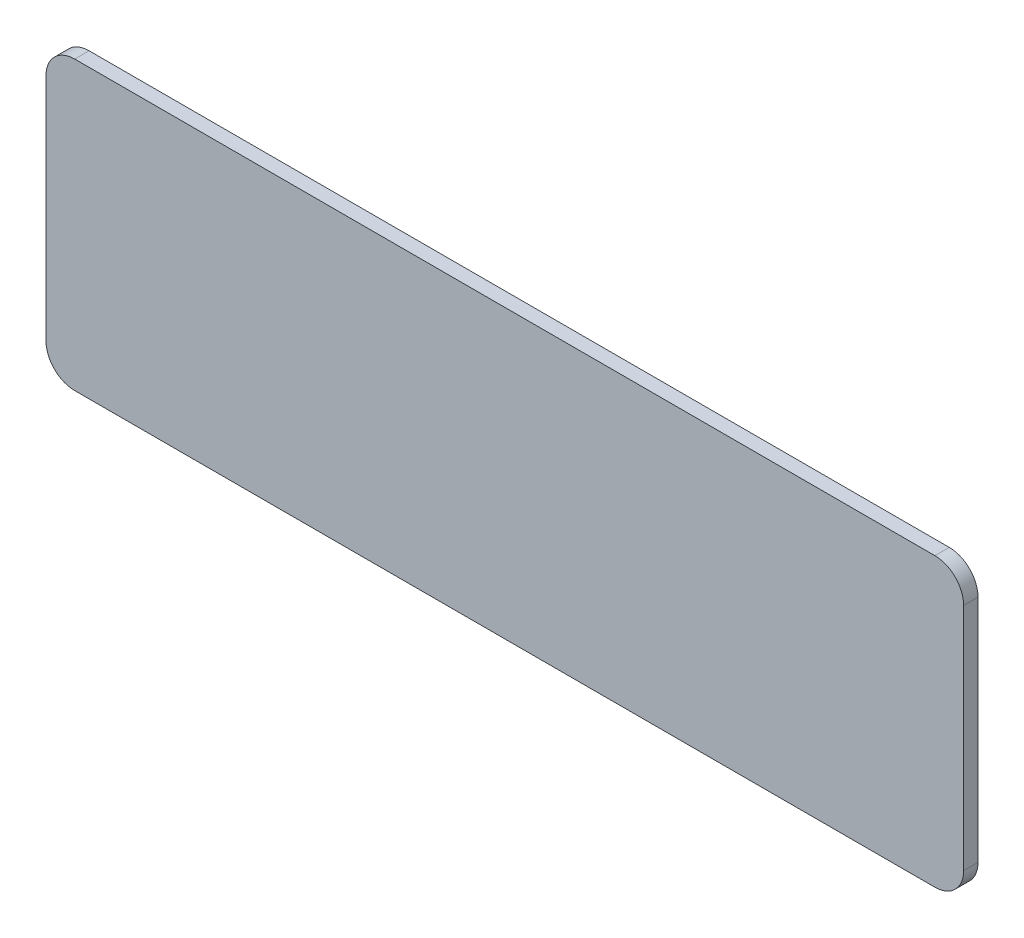
ISO-10303-21;
HEADER;
FILE_DESCRIPTION(('STEP AP214'),'2;1');
FILE_NAME('part.step','',(''),(''),'','','');
FILE_SCHEMA(('AUTOMOTIVE_DESIGN { 1 0 10303 214 1 1 1 1 }'));
ENDSEC;
DATA;
#1=APPLICATION_CONTEXT('core data for automotive mechanical design processes');
#2=APPLICATION_PROTOCOL_DEFINITION('international standard','automotive_design',2000,#1);
#3=PRODUCT_CONTEXT('',#1,'mechanical');
#4=PRODUCT('Part','Part','',(#3));
#5=PRODUCT_RELATED_PRODUCT_CATEGORY('part','',(#4));
#6=PRODUCT_DEFINITION_FORMATION('','',#4);
#7=PRODUCT_DEFINITION_CONTEXT('part definition',#1,'design');
#8=PRODUCT_DEFINITION('design','',#6,#7);
#9=PRODUCT_DEFINITION_SHAPE('','',#8);
#10=(LENGTH_UNIT() NAMED_UNIT(*) SI_UNIT(.MILLI.,.METRE.));
#11=(NAMED_UNIT(*) PLANE_ANGLE_UNIT() SI_UNIT($,.RADIAN.));
#12=(NAMED_UNIT(*) SI_UNIT($,.STERADIAN.) SOLID_ANGLE_UNIT());
#13=UNCERTAINTY_MEASURE_WITH_UNIT(LENGTH_MEASURE(1.E-05),#10,'distance_accuracy_value','');
#14=(GEOMETRIC_REPRESENTATION_CONTEXT(3) GLOBAL_UNCERTAINTY_ASSIGNED_CONTEXT((#13)) GLOBAL_UNIT_ASSIGNED_CONTEXT((#10,
#11,#12)) REPRESENTATION_CONTEXT('',''));
#15=CARTESIAN_POINT('',(0.,0.,0.));
#16=DIRECTION('',(0.,0.,1.));
#17=DIRECTION('',(1.,0.,0.));
#18=AXIS2_PLACEMENT_3D('',#15,#16,#17);
#19=CARTESIAN_POINT('',(419.14,80.0000000000001,10.));
#20=DIRECTION('',(0.,0.,-1.));
#21=DIRECTION('',(-1.,0.,0.));
#22=AXIS2_PLACEMENT_3D('',#19,#20,#21);
#23=CYLINDRICAL_SURFACE('',#22,20.);
#24=CARTESIAN_POINT('',(419.14,80.0000000000001,0.));
#25=DIRECTION('',(0.,0.,1.));
#26=DIRECTION('',(-1.,0.,0.));
#27=AXIS2_PLACEMENT_3D('',#24,#25,#26);
#28=CIRCLE('',#27,20.);
#29=CARTESIAN_POINT('',(439.14,80.0000000000001,0.));
#30=VERTEX_POINT('',#29);
#31=CARTESIAN_POINT('',(419.14,100.,0.));
#32=VERTEX_POINT('',#31);
#33=EDGE_CURVE('E129',#30,#32,#28,.T.);
#34=ORIENTED_EDGE('',*,*,#33,.T.);
#35=DIRECTION('',(0.,0.,-1.));
#36=VECTOR('',#35,1.);
#37=CARTESIAN_POINT('',(419.14,100.,10.));
#38=LINE('',#37,#36);
#39=CARTESIAN_POINT('',(419.14,100.,10.));
#40=VERTEX_POINT('',#39);
#41=EDGE_CURVE('E11',#40,#32,#38,.T.);
#42=ORIENTED_EDGE('',*,*,#41,.F.);
#43=CARTESIAN_POINT('',(419.14,80.0000000000001,10.));
#44=DIRECTION('',(0.,0.,1.));
#45=DIRECTION('',(-1.,0.,0.));
#46=AXIS2_PLACEMENT_3D('',#43,#44,#45);
#47=CIRCLE('',#46,20.);
#48=CARTESIAN_POINT('',(439.14,80.0000000000001,10.));
#49=VERTEX_POINT('',#48);
#50=EDGE_CURVE('E143',#49,#40,#47,.T.);
#51=ORIENTED_EDGE('',*,*,#50,.F.);
#52=DIRECTION('',(0.,0.,-1.));
#53=VECTOR('',#52,1.);
#54=CARTESIAN_POINT('',(439.14,80.0000000000001,10.));
#55=LINE('',#54,#53);
#56=EDGE_CURVE('E125',#49,#30,#55,.T.);
#57=ORIENTED_EDGE('',*,*,#56,.T.);
#58=EDGE_LOOP('',(#34,#42,#51,#57));
#59=FACE_BOUND('',#58,.T.);
#60=ADVANCED_FACE('F33',(#59),#23,.T.);
#61=CARTESIAN_POINT('',(419.14,100.,10.));
#62=DIRECTION('',(0.,-1.,0.));
#63=DIRECTION('',(1.,0.,0.));
#64=AXIS2_PLACEMENT_3D('',#61,#62,#63);
#65=PLANE('',#64);
#66=DIRECTION('',(-1.,0.,0.));
#67=VECTOR('',#66,1.);
#68=CARTESIAN_POINT('',(419.14,100.,0.));
#69=LINE('',#68,#67);
#70=CARTESIAN_POINT('',(-180.,100.,0.));
#71=VERTEX_POINT('',#70);
#72=EDGE_CURVE('E132',#32,#71,#69,.T.);
#73=ORIENTED_EDGE('',*,*,#72,.T.);
#74=DIRECTION('',(0.,0.,-1.));
#75=VECTOR('',#74,1.);
#76=CARTESIAN_POINT('',(-180.,100.,10.));
#77=LINE('',#76,#75);
#78=CARTESIAN_POINT('',(-180.,100.,10.));
#79=VERTEX_POINT('',#78);
#80=EDGE_CURVE('E41',#79,#71,#77,.T.);
#81=ORIENTED_EDGE('',*,*,#80,.F.);
#82=DIRECTION('',(-1.,0.,0.));
#83=VECTOR('',#82,1.);
#84=CARTESIAN_POINT('',(419.14,100.,10.));
#85=LINE('',#84,#83);
#86=EDGE_CURVE('E92',#40,#79,#85,.T.);
#87=ORIENTED_EDGE('',*,*,#86,.F.);
#88=ORIENTED_EDGE('',*,*,#41,.T.);
#89=EDGE_LOOP('',(#73,#81,#87,#88));
#90=FACE_BOUND('',#89,.T.);
#91=ADVANCED_FACE('F178',(#90),#65,.F.);
#92=CARTESIAN_POINT('',(-180.,80.,10.));
#93=DIRECTION('',(0.,0.,-1.));
#94=DIRECTION('',(-1.,0.,0.));
#95=AXIS2_PLACEMENT_3D('',#92,#93,#94);
#96=CYLINDRICAL_SURFACE('',#95,20.);
#97=CARTESIAN_POINT('',(-180.,80.,0.));
#98=DIRECTION('',(0.,0.,1.));
#99=DIRECTION('',(1.,0.,0.));
#100=AXIS2_PLACEMENT_3D('',#97,#98,#99);
#101=CIRCLE('',#100,20.);
#102=CARTESIAN_POINT('',(-200.,79.9999999999999,0.));
#103=VERTEX_POINT('',#102);
#104=EDGE_CURVE('E134',#71,#103,#101,.T.);
#105=ORIENTED_EDGE('',*,*,#104,.T.);
#106=DIRECTION('',(0.,0.,-1.));
#107=VECTOR('',#106,1.);
#108=CARTESIAN_POINT('',(-200.,79.9999999999999,10.));
#109=LINE('',#108,#107);
#110=CARTESIAN_POINT('',(-200.,79.9999999999999,10.));
#111=VERTEX_POINT('',#110);
#112=EDGE_CURVE('E150',#111,#103,#109,.T.);
#113=ORIENTED_EDGE('',*,*,#112,.F.);
#114=CARTESIAN_POINT('',(-180.,80.,10.));
#115=DIRECTION('',(0.,0.,1.));
#116=DIRECTION('',(1.,0.,0.));
#117=AXIS2_PLACEMENT_3D('',#114,#115,#116);
#118=CIRCLE('',#117,20.);
#119=EDGE_CURVE('E158',#79,#111,#118,.T.);
#120=ORIENTED_EDGE('',*,*,#119,.F.);
#121=ORIENTED_EDGE('',*,*,#80,.T.);
#122=EDGE_LOOP('',(#105,#113,#120,#121));
#123=FACE_BOUND('',#122,.T.);
#124=ADVANCED_FACE('F156',(#123),#96,.T.);
#125=CARTESIAN_POINT('',(-200.,79.9999999999999,10.));
#126=DIRECTION('',(1.,0.,0.));
#127=DIRECTION('',(0.,1.,0.));
#128=AXIS2_PLACEMENT_3D('',#125,#126,#127);
#129=PLANE('',#128);
#130=DIRECTION('',(0.,-1.,0.));
#131=VECTOR('',#130,1.);
#132=CARTESIAN_POINT('',(-200.,79.9999999999999,0.));
#133=LINE('',#132,#131);
#134=CARTESIAN_POINT('',(-200.,-79.9999999999999,0.));
#135=VERTEX_POINT('',#134);
#136=EDGE_CURVE('E136',#103,#135,#133,.T.);
#137=ORIENTED_EDGE('',*,*,#136,.T.);
#138=DIRECTION('',(0.,0.,-1.));
#139=VECTOR('',#138,1.);
#140=CARTESIAN_POINT('',(-200.,-79.9999999999999,10.));
#141=LINE('',#140,#139);
#142=CARTESIAN_POINT('',(-200.,-79.9999999999999,10.));
#143=VERTEX_POINT('',#142);
#144=EDGE_CURVE('E147',#143,#135,#141,.T.);
#145=ORIENTED_EDGE('',*,*,#144,.F.);
#146=DIRECTION('',(0.,-1.,0.));
#147=VECTOR('',#146,1.);
#148=CARTESIAN_POINT('',(-200.,79.9999999999999,10.));
#149=LINE('',#148,#147);
#150=EDGE_CURVE('E170',#111,#143,#149,.T.);
#151=ORIENTED_EDGE('',*,*,#150,.F.);
#152=ORIENTED_EDGE('',*,*,#112,.T.);
#153=EDGE_LOOP('',(#137,#145,#151,#152));
#154=FACE_BOUND('',#153,.T.);
#155=ADVANCED_FACE('F166',(#154),#129,.F.);
#156=CARTESIAN_POINT('',(-180.,-80.,10.));
#157=DIRECTION('',(0.,0.,-1.));
#158=DIRECTION('',(-1.,0.,0.));
#159=AXIS2_PLACEMENT_3D('',#156,#157,#158);
#160=CYLINDRICAL_SURFACE('',#159,20.);
#161=CARTESIAN_POINT('',(-180.,-80.,0.));
#162=DIRECTION('',(0.,0.,1.));
#163=DIRECTION('',(-1.,0.,0.));
#164=AXIS2_PLACEMENT_3D('',#161,#162,#163);
#165=CIRCLE('',#164,20.);
#166=CARTESIAN_POINT('',(-180.,-100.,0.));
#167=VERTEX_POINT('',#166);
#168=EDGE_CURVE('E138',#135,#167,#165,.T.);
#169=ORIENTED_EDGE('',*,*,#168,.T.);
#170=DIRECTION('',(0.,0.,-1.));
#171=VECTOR('',#170,1.);
#172=CARTESIAN_POINT('',(-180.,-100.,10.));
#173=LINE('',#172,#171);
#174=CARTESIAN_POINT('',(-180.,-100.,10.));
#175=VERTEX_POINT('',#174);
#176=EDGE_CURVE('E120',#175,#167,#173,.T.);
#177=ORIENTED_EDGE('',*,*,#176,.F.);
#178=CARTESIAN_POINT('',(-180.,-80.,10.));
#179=DIRECTION('',(0.,0.,1.));
#180=DIRECTION('',(-1.,0.,0.));
#181=AXIS2_PLACEMENT_3D('',#178,#179,#180);
#182=CIRCLE('',#181,20.);
#183=EDGE_CURVE('E111',#143,#175,#182,.T.);
#184=ORIENTED_EDGE('',*,*,#183,.F.);
#185=ORIENTED_EDGE('',*,*,#144,.T.);
#186=EDGE_LOOP('',(#169,#177,#184,#185));
#187=FACE_BOUND('',#186,.T.);
#188=ADVANCED_FACE('F169',(#187),#160,.T.);
#189=CARTESIAN_POINT('',(419.14,-99.9999999999999,10.));
#190=DIRECTION('',(0.,1.,0.));
#191=DIRECTION('',(-1.,0.,0.));
#192=AXIS2_PLACEMENT_3D('',#189,#190,#191);
#193=PLANE('',#192);
#194=DIRECTION('',(1.,0.,0.));
#195=VECTOR('',#194,1.);
#196=CARTESIAN_POINT('',(419.14,-99.9999999999999,0.));
#197=LINE('',#196,#195);
#198=CARTESIAN_POINT('',(419.14,-99.9999999999999,0.));
#199=VERTEX_POINT('',#198);
#200=EDGE_CURVE('E119',#167,#199,#197,.T.);
#201=ORIENTED_EDGE('',*,*,#200,.T.);
#202=DIRECTION('',(0.,0.,-1.));
#203=VECTOR('',#202,1.);
#204=CARTESIAN_POINT('',(419.14,-99.9999999999999,10.));
#205=LINE('',#204,#203);
#206=CARTESIAN_POINT('',(419.14,-99.9999999999999,10.));
#207=VERTEX_POINT('',#206);
#208=EDGE_CURVE('E116',#207,#199,#205,.T.);
#209=ORIENTED_EDGE('',*,*,#208,.F.);
#210=DIRECTION('',(1.,0.,0.));
#211=VECTOR('',#210,1.);
#212=CARTESIAN_POINT('',(419.14,-99.9999999999999,10.));
#213=LINE('',#212,#211);
#214=EDGE_CURVE('E105',#175,#207,#213,.T.);
#215=ORIENTED_EDGE('',*,*,#214,.F.);
#216=ORIENTED_EDGE('',*,*,#176,.T.);
#217=EDGE_LOOP('',(#201,#209,#215,#216));
#218=FACE_BOUND('',#217,.T.);
#219=ADVANCED_FACE('F117',(#218),#193,.F.);
#220=CARTESIAN_POINT('',(419.14,-79.9999999999999,10.));
#221=DIRECTION('',(0.,0.,-1.));
#222=DIRECTION('',(-1.,0.,0.));
#223=AXIS2_PLACEMENT_3D('',#220,#221,#222);
#224=CYLINDRICAL_SURFACE('',#223,20.);
#225=CARTESIAN_POINT('',(419.14,-79.9999999999999,0.));
#226=DIRECTION('',(0.,0.,1.));
#227=DIRECTION('',(-1.,0.,0.));
#228=AXIS2_PLACEMENT_3D('',#225,#226,#227);
#229=CIRCLE('',#228,20.);
#230=CARTESIAN_POINT('',(439.14,-79.9999999999999,0.));
#231=VERTEX_POINT('',#230);
#232=EDGE_CURVE('E78',#199,#231,#229,.T.);
#233=ORIENTED_EDGE('',*,*,#232,.T.);
#234=DIRECTION('',(0.,0.,-1.));
#235=VECTOR('',#234,1.);
#236=CARTESIAN_POINT('',(439.14,-79.9999999999999,10.));
#237=LINE('',#236,#235);
#238=CARTESIAN_POINT('',(439.14,-79.9999999999999,10.));
#239=VERTEX_POINT('',#238);
#240=EDGE_CURVE('E121',#239,#231,#237,.T.);
#241=ORIENTED_EDGE('',*,*,#240,.F.);
#242=CARTESIAN_POINT('',(419.14,-79.9999999999999,10.));
#243=DIRECTION('',(0.,0.,1.));
#244=DIRECTION('',(-1.,0.,0.));
#245=AXIS2_PLACEMENT_3D('',#242,#243,#244);
#246=CIRCLE('',#245,20.);
#247=EDGE_CURVE('E109',#207,#239,#246,.T.);
#248=ORIENTED_EDGE('',*,*,#247,.F.);
#249=ORIENTED_EDGE('',*,*,#208,.T.);
#250=EDGE_LOOP('',(#233,#241,#248,#249));
#251=FACE_BOUND('',#250,.T.);
#252=ADVANCED_FACE('F123',(#251),#224,.T.);
#253=CARTESIAN_POINT('',(439.14,80.0000000000001,10.));
#254=DIRECTION('',(-1.,0.,0.));
#255=DIRECTION('',(0.,0.,1.));
#256=AXIS2_PLACEMENT_3D('',#253,#254,#255);
#257=PLANE('',#256);
#258=DIRECTION('',(0.,1.,0.));
#259=VECTOR('',#258,1.);
#260=CARTESIAN_POINT('',(439.14,80.0000000000001,0.));
#261=LINE('',#260,#259);
#262=EDGE_CURVE('E84',#231,#30,#261,.T.);
#263=ORIENTED_EDGE('',*,*,#262,.T.);
#264=ORIENTED_EDGE('',*,*,#56,.F.);
#265=DIRECTION('',(0.,1.,0.));
#266=VECTOR('',#265,1.);
#267=CARTESIAN_POINT('',(439.14,80.0000000000001,10.));
#268=LINE('',#267,#266);
#269=EDGE_CURVE('E49',#239,#49,#268,.T.);
#270=ORIENTED_EDGE('',*,*,#269,.F.);
#271=ORIENTED_EDGE('',*,*,#240,.T.);
#272=EDGE_LOOP('',(#263,#264,#270,#271));
#273=FACE_BOUND('',#272,.T.);
#274=ADVANCED_FACE('F194',(#273),#257,.F.);
#275=CARTESIAN_POINT('',(419.14,80.0000000000001,10.));
#276=DIRECTION('',(0.,0.,-1.));
#277=DIRECTION('',(-1.,0.,0.));
#278=AXIS2_PLACEMENT_3D('',#275,#276,#277);
#279=PLANE('',#278);
#280=ORIENTED_EDGE('',*,*,#50,.T.);
#281=ORIENTED_EDGE('',*,*,#86,.T.);
#282=ORIENTED_EDGE('',*,*,#119,.T.);
#283=ORIENTED_EDGE('',*,*,#150,.T.);
#284=ORIENTED_EDGE('',*,*,#183,.T.);
#285=ORIENTED_EDGE('',*,*,#214,.T.);
#286=ORIENTED_EDGE('',*,*,#247,.T.);
#287=ORIENTED_EDGE('',*,*,#269,.T.);
#288=EDGE_LOOP('',(#280,#281,#282,#283,#284,#285,#286,#287));
#289=FACE_BOUND('',#288,.T.);
#290=ADVANCED_FACE('F107',(#289),#279,.F.);
#291=CARTESIAN_POINT('',(419.14,80.0000000000001,0.));
#292=DIRECTION('',(0.,0.,-1.));
#293=DIRECTION('',(-1.,0.,0.));
#294=AXIS2_PLACEMENT_3D('',#291,#292,#293);
#295=PLANE('',#294);
#296=ORIENTED_EDGE('',*,*,#33,.F.);
#297=ORIENTED_EDGE('',*,*,#262,.F.);
#298=ORIENTED_EDGE('',*,*,#232,.F.);
#299=ORIENTED_EDGE('',*,*,#200,.F.);
#300=ORIENTED_EDGE('',*,*,#168,.F.);
#301=ORIENTED_EDGE('',*,*,#136,.F.);
#302=ORIENTED_EDGE('',*,*,#104,.F.);
#303=ORIENTED_EDGE('',*,*,#72,.F.);
#304=EDGE_LOOP('',(#296,#297,#298,#299,#300,#301,#302,#303));
#305=FACE_BOUND('',#304,.T.);
#306=ADVANCED_FACE('F162',(#305),#295,.T.);
#307=CLOSED_SHELL('',(#60,#91,#124,#155,#188,#219,#252,#274,#290,#306));
#308=MANIFOLD_SOLID_BREP('B2',#307);
#309=ADVANCED_BREP_SHAPE_REPRESENTATION('',(#18,#308),#14);
#310=SHAPE_DEFINITION_REPRESENTATION(#9,#309);
ENDSEC;
END-ISO-10303-21;
